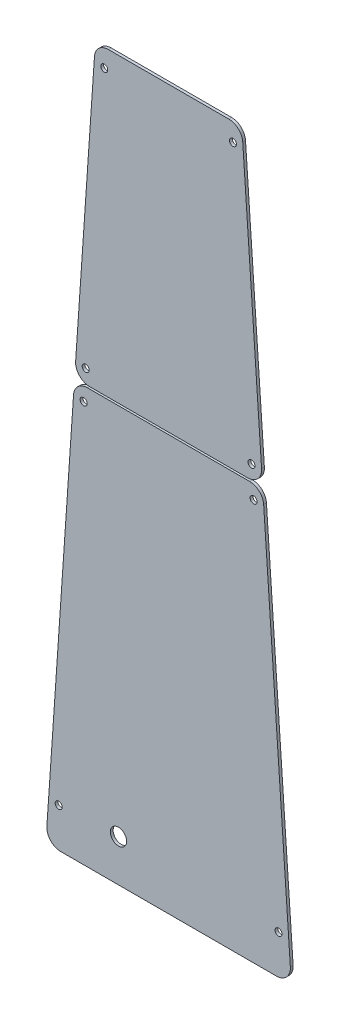
ISO-10303-21;
HEADER;
FILE_DESCRIPTION(('STEP AP214'),'2;1');
FILE_NAME('part.step','',(''),(''),'','','');
FILE_SCHEMA(('AUTOMOTIVE_DESIGN { 1 0 10303 214 1 1 1 1 }'));
ENDSEC;
DATA;
#1=APPLICATION_CONTEXT('core data for automotive mechanical design processes');
#2=APPLICATION_PROTOCOL_DEFINITION('international standard','automotive_design',2000,#1);
#3=PRODUCT_CONTEXT('',#1,'mechanical');
#4=PRODUCT('Part','Part','',(#3));
#5=PRODUCT_RELATED_PRODUCT_CATEGORY('part','',(#4));
#6=PRODUCT_DEFINITION_FORMATION('','',#4);
#7=PRODUCT_DEFINITION_CONTEXT('part definition',#1,'design');
#8=PRODUCT_DEFINITION('design','',#6,#7);
#9=PRODUCT_DEFINITION_SHAPE('','',#8);
#10=(LENGTH_UNIT() NAMED_UNIT(*) SI_UNIT(.MILLI.,.METRE.));
#11=(NAMED_UNIT(*) PLANE_ANGLE_UNIT() SI_UNIT($,.RADIAN.));
#12=(NAMED_UNIT(*) SI_UNIT($,.STERADIAN.) SOLID_ANGLE_UNIT());
#13=UNCERTAINTY_MEASURE_WITH_UNIT(LENGTH_MEASURE(1.E-05),#10,'distance_accuracy_value','');
#14=(GEOMETRIC_REPRESENTATION_CONTEXT(3) GLOBAL_UNCERTAINTY_ASSIGNED_CONTEXT((#13)) GLOBAL_UNIT_ASSIGNED_CONTEXT((#10,
#11,#12)) REPRESENTATION_CONTEXT('',''));
#15=CARTESIAN_POINT('',(0.,0.,0.));
#16=DIRECTION('',(0.,0.,1.));
#17=DIRECTION('',(1.,0.,0.));
#18=AXIS2_PLACEMENT_3D('',#15,#16,#17);
#19=CARTESIAN_POINT('',(87.5838343773248,6.03733227261171,2.));
#20=DIRECTION('',(0.997632620355245,0.0687688505293422,0.));
#21=DIRECTION('',(-0.0687688505293422,0.997632620355245,0.));
#22=AXIS2_PLACEMENT_3D('',#19,#20,#21);
#23=PLANE('',#22);
#24=DIRECTION('',(0.0687688505293422,-0.997632620355245,0.));
#25=VECTOR('',#24,1.);
#26=CARTESIAN_POINT('',(87.5838343773248,6.03733227261171,2.));
#27=LINE('',#26,#25);
#28=CARTESIAN_POINT('',(53.1419166175963,505.687688505293,2.));
#29=VERTEX_POINT('',#28);
#30=CARTESIAN_POINT('',(66.6525962292467,309.687688505294,2.));
#31=VERTEX_POINT('',#30);
#32=EDGE_CURVE('E127',#29,#31,#27,.T.);
#33=ORIENTED_EDGE('',*,*,#32,.T.);
#34=DIRECTION('',(0.,0.,-1.));
#35=VECTOR('',#34,1.);
#36=CARTESIAN_POINT('',(66.6525962292468,309.687688505293,2.));
#37=LINE('',#36,#35);
#38=CARTESIAN_POINT('',(66.6525962292467,309.687688505294,0.));
#39=VERTEX_POINT('',#38);
#40=EDGE_CURVE('E12',#31,#39,#37,.T.);
#41=ORIENTED_EDGE('',*,*,#40,.T.);
#42=DIRECTION('',(0.0687688505293422,-0.997632620355245,0.));
#43=VECTOR('',#42,1.);
#44=CARTESIAN_POINT('',(87.5838343773248,6.03733227261171,0.));
#45=LINE('',#44,#43);
#46=CARTESIAN_POINT('',(53.1419166175963,505.687688505293,0.));
#47=VERTEX_POINT('',#46);
#48=EDGE_CURVE('E142',#47,#39,#45,.T.);
#49=ORIENTED_EDGE('',*,*,#48,.F.);
#50=DIRECTION('',(0.,0.,-1.));
#51=VECTOR('',#50,1.);
#52=CARTESIAN_POINT('',(53.1419166175963,505.687688505293,2.));
#53=LINE('',#52,#51);
#54=EDGE_CURVE('E150',#47,#29,#53,.F.);
#55=ORIENTED_EDGE('',*,*,#54,.T.);
#56=EDGE_LOOP('',(#33,#41,#49,#55));
#57=FACE_BOUND('',#56,.T.);
#58=ADVANCED_FACE('F54',(#57),#23,.T.);
#59=CARTESIAN_POINT('',(-87.5838343773248,6.03733227261171,2.));
#60=DIRECTION('',(0.997632620355245,-0.0687688505293422,0.));
#61=DIRECTION('',(0.0687688505293422,0.997632620355245,0.));
#62=AXIS2_PLACEMENT_3D('',#59,#60,#61);
#63=PLANE('',#62);
#64=DIRECTION('',(-0.0687688505293422,-0.997632620355245,0.));
#65=VECTOR('',#64,1.);
#66=CARTESIAN_POINT('',(-87.5838343773248,6.03733227261171,0.));
#67=LINE('',#66,#65);
#68=CARTESIAN_POINT('',(-53.1419166175963,505.687688505293,0.));
#69=VERTEX_POINT('',#68);
#70=CARTESIAN_POINT('',(-66.6525962292467,309.687688505294,0.));
#71=VERTEX_POINT('',#70);
#72=EDGE_CURVE('E157',#69,#71,#67,.T.);
#73=ORIENTED_EDGE('',*,*,#72,.T.);
#74=DIRECTION('',(0.,0.,-1.));
#75=VECTOR('',#74,1.);
#76=CARTESIAN_POINT('',(-66.6525962292468,309.687688505293,2.));
#77=LINE('',#76,#75);
#78=CARTESIAN_POINT('',(-66.6525962292467,309.687688505294,2.));
#79=VERTEX_POINT('',#78);
#80=EDGE_CURVE('E77',#71,#79,#77,.F.);
#81=ORIENTED_EDGE('',*,*,#80,.T.);
#82=DIRECTION('',(-0.0687688505293422,-0.997632620355245,0.));
#83=VECTOR('',#82,1.);
#84=CARTESIAN_POINT('',(-87.5838343773248,6.03733227261171,2.));
#85=LINE('',#84,#83);
#86=CARTESIAN_POINT('',(-53.1419166175963,505.687688505293,2.));
#87=VERTEX_POINT('',#86);
#88=EDGE_CURVE('E176',#87,#79,#85,.T.);
#89=ORIENTED_EDGE('',*,*,#88,.F.);
#90=DIRECTION('',(0.,0.,-1.));
#91=VECTOR('',#90,1.);
#92=CARTESIAN_POINT('',(-53.1419166175963,505.687688505293,0.));
#93=LINE('',#92,#91);
#94=EDGE_CURVE('E151',#87,#69,#93,.T.);
#95=ORIENTED_EDGE('',*,*,#94,.T.);
#96=EDGE_LOOP('',(#73,#81,#89,#95));
#97=FACE_BOUND('',#96,.T.);
#98=ADVANCED_FACE('F217',(#97),#63,.F.);
#99=CARTESIAN_POINT('',(0.,0.,2.));
#100=DIRECTION('',(0.,0.,1.));
#101=DIRECTION('',(1.,0.,0.));
#102=AXIS2_PLACEMENT_3D('',#99,#100,#101);
#103=PLANE('',#102);
#104=CARTESIAN_POINT('',(-59.4327957686284,309.,2.));
#105=DIRECTION('',(0.,0.,1.));
#106=DIRECTION('',(1.,0.,0.));
#107=AXIS2_PLACEMENT_3D('',#104,#105,#106);
#108=CIRCLE('',#107,2.5);
#109=CARTESIAN_POINT('',(-56.9327957686284,309.,2.));
#110=VERTEX_POINT('',#109);
#111=EDGE_CURVE('E177',#110,#110,#108,.F.);
#112=ORIENTED_EDGE('',*,*,#111,.T.);
#113=EDGE_LOOP('',(#112));
#114=FACE_BOUND('',#113,.T.);
#115=CARTESIAN_POINT('',(46.1289122734827,502.,2.));
#116=DIRECTION('',(0.,0.,1.));
#117=DIRECTION('',(1.,0.,0.));
#118=AXIS2_PLACEMENT_3D('',#115,#116,#117);
#119=CIRCLE('',#118,2.5);
#120=CARTESIAN_POINT('',(48.6289122734827,502.,2.));
#121=VERTEX_POINT('',#120);
#122=EDGE_CURVE('E169',#121,#121,#119,.T.);
#123=ORIENTED_EDGE('',*,*,#122,.F.);
#124=EDGE_LOOP('',(#123));
#125=FACE_BOUND('',#124,.T.);
#126=CARTESIAN_POINT('',(-46.1289122734827,502.,2.));
#127=DIRECTION('',(0.,0.,1.));
#128=DIRECTION('',(1.,0.,0.));
#129=AXIS2_PLACEMENT_3D('',#126,#127,#128);
#130=CIRCLE('',#129,2.5);
#131=CARTESIAN_POINT('',(-43.6289122734827,502.,2.));
#132=VERTEX_POINT('',#131);
#133=EDGE_CURVE('E173',#132,#132,#130,.F.);
#134=ORIENTED_EDGE('',*,*,#133,.T.);
#135=EDGE_LOOP('',(#134));
#136=FACE_BOUND('',#135,.T.);
#137=CARTESIAN_POINT('',(59.4327957686284,309.,2.));
#138=DIRECTION('',(0.,0.,1.));
#139=DIRECTION('',(1.,0.,0.));
#140=AXIS2_PLACEMENT_3D('',#137,#138,#139);
#141=CIRCLE('',#140,2.5);
#142=CARTESIAN_POINT('',(61.9327957686284,309.,2.));
#143=VERTEX_POINT('',#142);
#144=EDGE_CURVE('E171',#143,#143,#141,.T.);
#145=ORIENTED_EDGE('',*,*,#144,.F.);
#146=EDGE_LOOP('',(#145));
#147=FACE_BOUND('',#146,.T.);
#148=ORIENTED_EDGE('',*,*,#88,.T.);
#149=CARTESIAN_POINT('',(-56.6762700256943,309.,2.));
#150=DIRECTION('',(0.,0.,1.));
#151=DIRECTION('',(1.,0.,0.));
#152=AXIS2_PLACEMENT_3D('',#149,#150,#151);
#153=CIRCLE('',#152,10.);
#154=CARTESIAN_POINT('',(-56.6762700256943,299.,2.));
#155=VERTEX_POINT('',#154);
#156=EDGE_CURVE('E62',#79,#155,#153,.T.);
#157=ORIENTED_EDGE('',*,*,#156,.T.);
#158=DIRECTION('',(1.,0.,0.));
#159=VECTOR('',#158,1.);
#160=CARTESIAN_POINT('',(0.,299.,2.));
#161=LINE('',#160,#159);
#162=CARTESIAN_POINT('',(56.6762700256943,299.,2.));
#163=VERTEX_POINT('',#162);
#164=EDGE_CURVE('E132',#155,#163,#161,.T.);
#165=ORIENTED_EDGE('',*,*,#164,.T.);
#166=CARTESIAN_POINT('',(56.6762700256943,309.,2.));
#167=DIRECTION('',(0.,0.,1.));
#168=DIRECTION('',(1.,0.,0.));
#169=AXIS2_PLACEMENT_3D('',#166,#167,#168);
#170=CIRCLE('',#169,10.);
#171=EDGE_CURVE('E69',#163,#31,#170,.T.);
#172=ORIENTED_EDGE('',*,*,#171,.T.);
#173=ORIENTED_EDGE('',*,*,#32,.F.);
#174=CARTESIAN_POINT('',(43.1655904140438,505.,2.));
#175=DIRECTION('',(0.,0.,1.));
#176=DIRECTION('',(1.,0.,0.));
#177=AXIS2_PLACEMENT_3D('',#174,#175,#176);
#178=CIRCLE('',#177,10.);
#179=CARTESIAN_POINT('',(43.1655904140438,515.,2.));
#180=VERTEX_POINT('',#179);
#181=EDGE_CURVE('E122',#29,#180,#178,.T.);
#182=ORIENTED_EDGE('',*,*,#181,.T.);
#183=DIRECTION('',(1.,0.,0.));
#184=VECTOR('',#183,1.);
#185=CARTESIAN_POINT('',(0.,515.,2.));
#186=LINE('',#185,#184);
#187=CARTESIAN_POINT('',(-43.1655904140438,515.,2.));
#188=VERTEX_POINT('',#187);
#189=EDGE_CURVE('E125',#188,#180,#186,.T.);
#190=ORIENTED_EDGE('',*,*,#189,.F.);
#191=CARTESIAN_POINT('',(-43.1655904140438,505.,2.));
#192=DIRECTION('',(0.,0.,1.));
#193=DIRECTION('',(1.,0.,0.));
#194=AXIS2_PLACEMENT_3D('',#191,#192,#193);
#195=CIRCLE('',#194,10.);
#196=EDGE_CURVE('E131',#188,#87,#195,.T.);
#197=ORIENTED_EDGE('',*,*,#196,.T.);
#198=EDGE_LOOP('',(#148,#157,#165,#172,#173,#182,#190,#197));
#199=FACE_BOUND('',#198,.T.);
#200=ADVANCED_FACE('F124',(#114,#125,#136,#147,#199),#103,.T.);
#201=CARTESIAN_POINT('',(0.,0.,0.));
#202=DIRECTION('',(0.,0.,1.));
#203=DIRECTION('',(1.,0.,0.));
#204=AXIS2_PLACEMENT_3D('',#201,#202,#203);
#205=PLANE('',#204);
#206=CARTESIAN_POINT('',(59.4327957686284,309.,0.));
#207=DIRECTION('',(0.,0.,-1.));
#208=DIRECTION('',(-1.,0.,0.));
#209=AXIS2_PLACEMENT_3D('',#206,#207,#208);
#210=CIRCLE('',#209,2.5);
#211=CARTESIAN_POINT('',(56.9327957686284,309.,0.));
#212=VERTEX_POINT('',#211);
#213=EDGE_CURVE('E181',#212,#212,#210,.T.);
#214=ORIENTED_EDGE('',*,*,#213,.F.);
#215=EDGE_LOOP('',(#214));
#216=FACE_BOUND('',#215,.T.);
#217=CARTESIAN_POINT('',(-46.1289122734827,502.,0.));
#218=DIRECTION('',(0.,0.,1.));
#219=DIRECTION('',(1.,0.,0.));
#220=AXIS2_PLACEMENT_3D('',#217,#218,#219);
#221=CIRCLE('',#220,2.5);
#222=CARTESIAN_POINT('',(-43.6289122734827,502.,0.));
#223=VERTEX_POINT('',#222);
#224=EDGE_CURVE('E147',#223,#223,#221,.F.);
#225=ORIENTED_EDGE('',*,*,#224,.F.);
#226=EDGE_LOOP('',(#225));
#227=FACE_BOUND('',#226,.T.);
#228=CARTESIAN_POINT('',(46.1289122734827,502.,0.));
#229=DIRECTION('',(0.,0.,1.));
#230=DIRECTION('',(1.,0.,0.));
#231=AXIS2_PLACEMENT_3D('',#228,#229,#230);
#232=CIRCLE('',#231,2.5);
#233=CARTESIAN_POINT('',(48.6289122734827,502.,0.));
#234=VERTEX_POINT('',#233);
#235=EDGE_CURVE('E154',#234,#234,#232,.T.);
#236=ORIENTED_EDGE('',*,*,#235,.T.);
#237=EDGE_LOOP('',(#236));
#238=FACE_BOUND('',#237,.T.);
#239=CARTESIAN_POINT('',(-59.4327957686284,309.,0.));
#240=DIRECTION('',(0.,0.,-1.));
#241=DIRECTION('',(-1.,0.,0.));
#242=AXIS2_PLACEMENT_3D('',#239,#240,#241);
#243=CIRCLE('',#242,2.5);
#244=CARTESIAN_POINT('',(-61.9327957686284,309.,0.));
#245=VERTEX_POINT('',#244);
#246=EDGE_CURVE('E165',#245,#245,#243,.F.);
#247=ORIENTED_EDGE('',*,*,#246,.T.);
#248=EDGE_LOOP('',(#247));
#249=FACE_BOUND('',#248,.T.);
#250=DIRECTION('',(-1.,0.,0.));
#251=VECTOR('',#250,1.);
#252=CARTESIAN_POINT('',(0.,299.,0.));
#253=LINE('',#252,#251);
#254=CARTESIAN_POINT('',(56.6762700256943,299.,0.));
#255=VERTEX_POINT('',#254);
#256=CARTESIAN_POINT('',(-56.6762700256943,299.,0.));
#257=VERTEX_POINT('',#256);
#258=EDGE_CURVE('E162',#255,#257,#253,.T.);
#259=ORIENTED_EDGE('',*,*,#258,.T.);
#260=CARTESIAN_POINT('',(-56.6762700256943,309.,0.));
#261=DIRECTION('',(0.,0.,1.));
#262=DIRECTION('',(1.,0.,0.));
#263=AXIS2_PLACEMENT_3D('',#260,#261,#262);
#264=CIRCLE('',#263,10.);
#265=EDGE_CURVE('E202',#257,#71,#264,.F.);
#266=ORIENTED_EDGE('',*,*,#265,.T.);
#267=ORIENTED_EDGE('',*,*,#72,.F.);
#268=CARTESIAN_POINT('',(-43.1655904140438,505.,0.));
#269=DIRECTION('',(0.,0.,1.));
#270=DIRECTION('',(1.,0.,0.));
#271=AXIS2_PLACEMENT_3D('',#268,#269,#270);
#272=CIRCLE('',#271,10.);
#273=CARTESIAN_POINT('',(-43.1655904140438,515.,0.));
#274=VERTEX_POINT('',#273);
#275=EDGE_CURVE('E160',#69,#274,#272,.F.);
#276=ORIENTED_EDGE('',*,*,#275,.T.);
#277=DIRECTION('',(1.,0.,0.));
#278=VECTOR('',#277,1.);
#279=CARTESIAN_POINT('',(0.,515.,0.));
#280=LINE('',#279,#278);
#281=CARTESIAN_POINT('',(43.1655904140438,515.,0.));
#282=VERTEX_POINT('',#281);
#283=EDGE_CURVE('E159',#274,#282,#280,.T.);
#284=ORIENTED_EDGE('',*,*,#283,.T.);
#285=CARTESIAN_POINT('',(43.1655904140438,505.,0.));
#286=DIRECTION('',(0.,0.,1.));
#287=DIRECTION('',(1.,0.,0.));
#288=AXIS2_PLACEMENT_3D('',#285,#286,#287);
#289=CIRCLE('',#288,10.);
#290=EDGE_CURVE('E145',#282,#47,#289,.F.);
#291=ORIENTED_EDGE('',*,*,#290,.T.);
#292=ORIENTED_EDGE('',*,*,#48,.T.);
#293=CARTESIAN_POINT('',(56.6762700256943,309.,0.));
#294=DIRECTION('',(0.,0.,1.));
#295=DIRECTION('',(1.,0.,0.));
#296=AXIS2_PLACEMENT_3D('',#293,#294,#295);
#297=CIRCLE('',#296,10.);
#298=EDGE_CURVE('E200',#39,#255,#297,.F.);
#299=ORIENTED_EDGE('',*,*,#298,.T.);
#300=EDGE_LOOP('',(#259,#266,#267,#276,#284,#291,#292,#299));
#301=FACE_BOUND('',#300,.T.);
#302=ADVANCED_FACE('F216',(#216,#227,#238,#249,#301),#205,.F.);
#303=CARTESIAN_POINT('',(0.,515.,2.));
#304=DIRECTION('',(0.,1.,0.));
#305=DIRECTION('',(0.,0.,1.));
#306=AXIS2_PLACEMENT_3D('',#303,#304,#305);
#307=PLANE('',#306);
#308=ORIENTED_EDGE('',*,*,#189,.T.);
#309=DIRECTION('',(0.,0.,-1.));
#310=VECTOR('',#309,1.);
#311=CARTESIAN_POINT('',(43.1655904140438,515.,2.));
#312=LINE('',#311,#310);
#313=EDGE_CURVE('E138',#180,#282,#312,.T.);
#314=ORIENTED_EDGE('',*,*,#313,.T.);
#315=ORIENTED_EDGE('',*,*,#283,.F.);
#316=DIRECTION('',(0.,0.,-1.));
#317=VECTOR('',#316,1.);
#318=CARTESIAN_POINT('',(-43.1655904140438,515.,2.));
#319=LINE('',#318,#317);
#320=EDGE_CURVE('E141',#274,#188,#319,.F.);
#321=ORIENTED_EDGE('',*,*,#320,.T.);
#322=EDGE_LOOP('',(#308,#314,#315,#321));
#323=FACE_BOUND('',#322,.T.);
#324=ADVANCED_FACE('F136',(#323),#307,.T.);
#325=CARTESIAN_POINT('',(-46.1289122734827,502.,2.));
#326=DIRECTION('',(0.,0.,-1.));
#327=DIRECTION('',(-1.,0.,0.));
#328=AXIS2_PLACEMENT_3D('',#325,#326,#327);
#329=CYLINDRICAL_SURFACE('',#328,2.5);
#330=ORIENTED_EDGE('',*,*,#133,.F.);
#331=EDGE_LOOP('',(#330));
#332=FACE_BOUND('',#331,.T.);
#333=ORIENTED_EDGE('',*,*,#224,.T.);
#334=EDGE_LOOP('',(#333));
#335=FACE_BOUND('',#334,.T.);
#336=ADVANCED_FACE('F255',(#332,#335),#329,.F.);
#337=CARTESIAN_POINT('',(46.1289122734827,502.,2.));
#338=DIRECTION('',(0.,0.,-1.));
#339=DIRECTION('',(-1.,0.,0.));
#340=AXIS2_PLACEMENT_3D('',#337,#338,#339);
#341=CYLINDRICAL_SURFACE('',#340,2.5);
#342=ORIENTED_EDGE('',*,*,#122,.T.);
#343=EDGE_LOOP('',(#342));
#344=FACE_BOUND('',#343,.T.);
#345=ORIENTED_EDGE('',*,*,#235,.F.);
#346=EDGE_LOOP('',(#345));
#347=FACE_BOUND('',#346,.T.);
#348=ADVANCED_FACE('F252',(#344,#347),#341,.F.);
#349=CARTESIAN_POINT('',(43.1655904140438,505.,2.));
#350=DIRECTION('',(0.,0.,-1.));
#351=DIRECTION('',(-1.,0.,0.));
#352=AXIS2_PLACEMENT_3D('',#349,#350,#351);
#353=CYLINDRICAL_SURFACE('',#352,10.);
#354=ORIENTED_EDGE('',*,*,#181,.F.);
#355=ORIENTED_EDGE('',*,*,#54,.F.);
#356=ORIENTED_EDGE('',*,*,#290,.F.);
#357=ORIENTED_EDGE('',*,*,#313,.F.);
#358=EDGE_LOOP('',(#354,#355,#356,#357));
#359=FACE_BOUND('',#358,.T.);
#360=ADVANCED_FACE('F144',(#359),#353,.T.);
#361=CARTESIAN_POINT('',(-43.1655904140438,505.,2.));
#362=DIRECTION('',(0.,0.,1.));
#363=DIRECTION('',(1.,0.,0.));
#364=AXIS2_PLACEMENT_3D('',#361,#362,#363);
#365=CYLINDRICAL_SURFACE('',#364,10.);
#366=ORIENTED_EDGE('',*,*,#196,.F.);
#367=ORIENTED_EDGE('',*,*,#320,.F.);
#368=ORIENTED_EDGE('',*,*,#275,.F.);
#369=ORIENTED_EDGE('',*,*,#94,.F.);
#370=EDGE_LOOP('',(#366,#367,#368,#369));
#371=FACE_BOUND('',#370,.T.);
#372=ADVANCED_FACE('F220',(#371),#365,.T.);
#373=CARTESIAN_POINT('',(-59.4327957686284,309.,10.));
#374=DIRECTION('',(0.,0.,-1.));
#375=DIRECTION('',(-1.,0.,0.));
#376=AXIS2_PLACEMENT_3D('',#373,#374,#375);
#377=CYLINDRICAL_SURFACE('',#376,2.5);
#378=ORIENTED_EDGE('',*,*,#111,.F.);
#379=EDGE_LOOP('',(#378));
#380=FACE_BOUND('',#379,.T.);
#381=ORIENTED_EDGE('',*,*,#246,.F.);
#382=EDGE_LOOP('',(#381));
#383=FACE_BOUND('',#382,.T.);
#384=ADVANCED_FACE('F243',(#380,#383),#377,.F.);
#385=CARTESIAN_POINT('',(59.4327957686284,309.,10.));
#386=DIRECTION('',(0.,0.,-1.));
#387=DIRECTION('',(-1.,0.,0.));
#388=AXIS2_PLACEMENT_3D('',#385,#386,#387);
#389=CYLINDRICAL_SURFACE('',#388,2.5);
#390=ORIENTED_EDGE('',*,*,#144,.T.);
#391=EDGE_LOOP('',(#390));
#392=FACE_BOUND('',#391,.T.);
#393=ORIENTED_EDGE('',*,*,#213,.T.);
#394=EDGE_LOOP('',(#393));
#395=FACE_BOUND('',#394,.T.);
#396=ADVANCED_FACE('F246',(#392,#395),#389,.F.);
#397=CARTESIAN_POINT('',(0.,299.,10.));
#398=DIRECTION('',(0.,-1.,0.));
#399=DIRECTION('',(0.,0.,-1.));
#400=AXIS2_PLACEMENT_3D('',#397,#398,#399);
#401=PLANE('',#400);
#402=ORIENTED_EDGE('',*,*,#164,.F.);
#403=DIRECTION('',(0.,0.,-1.));
#404=VECTOR('',#403,1.);
#405=CARTESIAN_POINT('',(-56.6762700256943,299.,0.));
#406=LINE('',#405,#404);
#407=EDGE_CURVE('E197',#155,#257,#406,.T.);
#408=ORIENTED_EDGE('',*,*,#407,.T.);
#409=ORIENTED_EDGE('',*,*,#258,.F.);
#410=DIRECTION('',(0.,0.,-1.));
#411=VECTOR('',#410,1.);
#412=CARTESIAN_POINT('',(56.6762700256943,299.,10.));
#413=LINE('',#412,#411);
#414=EDGE_CURVE('E186',#255,#163,#413,.F.);
#415=ORIENTED_EDGE('',*,*,#414,.T.);
#416=EDGE_LOOP('',(#402,#408,#409,#415));
#417=FACE_BOUND('',#416,.T.);
#418=ADVANCED_FACE('F210',(#417),#401,.T.);
#419=CARTESIAN_POINT('',(-56.6762700256943,309.,10.));
#420=DIRECTION('',(0.,0.,1.));
#421=DIRECTION('',(1.,0.,0.));
#422=AXIS2_PLACEMENT_3D('',#419,#420,#421);
#423=CYLINDRICAL_SURFACE('',#422,10.);
#424=ORIENTED_EDGE('',*,*,#156,.F.);
#425=ORIENTED_EDGE('',*,*,#80,.F.);
#426=ORIENTED_EDGE('',*,*,#265,.F.);
#427=ORIENTED_EDGE('',*,*,#407,.F.);
#428=EDGE_LOOP('',(#424,#425,#426,#427));
#429=FACE_BOUND('',#428,.T.);
#430=ADVANCED_FACE('F213',(#429),#423,.T.);
#431=CARTESIAN_POINT('',(56.6762700256943,309.,2.));
#432=DIRECTION('',(0.,0.,-1.));
#433=DIRECTION('',(-1.,0.,0.));
#434=AXIS2_PLACEMENT_3D('',#431,#432,#433);
#435=CYLINDRICAL_SURFACE('',#434,10.);
#436=ORIENTED_EDGE('',*,*,#171,.F.);
#437=ORIENTED_EDGE('',*,*,#414,.F.);
#438=ORIENTED_EDGE('',*,*,#298,.F.);
#439=ORIENTED_EDGE('',*,*,#40,.F.);
#440=EDGE_LOOP('',(#436,#437,#438,#439));
#441=FACE_BOUND('',#440,.T.);
#442=ADVANCED_FACE('F56',(#441),#435,.T.);
#443=CLOSED_SHELL('',(#58,#98,#200,#302,#324,#336,#348,#360,#372,#384,#396,#418,#430,#442));
#444=MANIFOLD_SOLID_BREP('B2',#443);
#445=CARTESIAN_POINT('',(78.799252079308,28.05,2.));
#446=DIRECTION('',(0.,0.,-1.));
#447=DIRECTION('',(-1.,0.,0.));
#448=AXIS2_PLACEMENT_3D('',#445,#446,#447);
#449=CYLINDRICAL_SURFACE('',#448,2.50000000000001);
#450=CARTESIAN_POINT('',(78.799252079308,28.05,2.));
#451=DIRECTION('',(0.,0.,1.));
#452=DIRECTION('',(1.,0.,0.));
#453=AXIS2_PLACEMENT_3D('',#450,#451,#452);
#454=CIRCLE('',#453,2.50000000000001);
#455=CARTESIAN_POINT('',(81.299252079308,28.05,2.));
#456=VERTEX_POINT('',#455);
#457=EDGE_CURVE('E464',#456,#456,#454,.T.);
#458=ORIENTED_EDGE('',*,*,#457,.T.);
#459=EDGE_LOOP('',(#458));
#460=FACE_BOUND('',#459,.T.);
#461=CARTESIAN_POINT('',(78.799252079308,28.05,0.));
#462=DIRECTION('',(0.,0.,1.));
#463=DIRECTION('',(1.,0.,0.));
#464=AXIS2_PLACEMENT_3D('',#461,#462,#463);
#465=CIRCLE('',#464,2.50000000000001);
#466=CARTESIAN_POINT('',(81.299252079308,28.05,0.));
#467=VERTEX_POINT('',#466);
#468=EDGE_CURVE('E471',#467,#467,#465,.T.);
#469=ORIENTED_EDGE('',*,*,#468,.F.);
#470=EDGE_LOOP('',(#469));
#471=FACE_BOUND('',#470,.T.);
#472=ADVANCED_FACE('F371',(#460,#471),#449,.F.);
#473=CARTESIAN_POINT('',(-77.2869496373448,9.99999999999998,2.));
#474=DIRECTION('',(0.,0.,1.));
#475=DIRECTION('',(1.,0.,0.));
#476=AXIS2_PLACEMENT_3D('',#473,#474,#475);
#477=CYLINDRICAL_SURFACE('',#476,10.);
#478=CARTESIAN_POINT('',(-77.2869496373448,9.99999999999998,2.));
#479=DIRECTION('',(0.,0.,1.));
#480=DIRECTION('',(1.,0.,0.));
#481=AXIS2_PLACEMENT_3D('',#478,#479,#480);
#482=CIRCLE('',#481,10.);
#483=CARTESIAN_POINT('',(-87.2632758408973,10.6876885052934,2.));
#484=VERTEX_POINT('',#483);
#485=CARTESIAN_POINT('',(-77.2869496373448,0.,2.));
#486=VERTEX_POINT('',#485);
#487=EDGE_CURVE('E479',#484,#486,#482,.T.);
#488=ORIENTED_EDGE('',*,*,#487,.F.);
#489=DIRECTION('',(0.,0.,-1.));
#490=VECTOR('',#489,1.);
#491=CARTESIAN_POINT('',(-87.2632758408973,10.6876885052934,2.));
#492=LINE('',#491,#490);
#493=CARTESIAN_POINT('',(-87.2632758408973,10.6876885052934,0.));
#494=VERTEX_POINT('',#493);
#495=EDGE_CURVE('E475',#494,#484,#492,.F.);
#496=ORIENTED_EDGE('',*,*,#495,.F.);
#497=CARTESIAN_POINT('',(-77.2869496373448,9.99999999999998,0.));
#498=DIRECTION('',(0.,0.,1.));
#499=DIRECTION('',(1.,0.,0.));
#500=AXIS2_PLACEMENT_3D('',#497,#498,#499);
#501=CIRCLE('',#500,10.);
#502=CARTESIAN_POINT('',(-77.2869496373448,0.,0.));
#503=VERTEX_POINT('',#502);
#504=EDGE_CURVE('E448',#503,#494,#501,.F.);
#505=ORIENTED_EDGE('',*,*,#504,.F.);
#506=DIRECTION('',(0.,0.,-1.));
#507=VECTOR('',#506,1.);
#508=CARTESIAN_POINT('',(-77.2869496373448,0.,0.));
#509=LINE('',#508,#507);
#510=EDGE_CURVE('E449',#486,#503,#509,.T.);
#511=ORIENTED_EDGE('',*,*,#510,.F.);
#512=EDGE_LOOP('',(#488,#496,#505,#511));
#513=FACE_BOUND('',#512,.T.);
#514=ADVANCED_FACE('F547',(#513),#477,.T.);
#515=CARTESIAN_POINT('',(0.,0.,2.));
#516=DIRECTION('',(0.,-1.,0.));
#517=DIRECTION('',(0.,0.,-1.));
#518=AXIS2_PLACEMENT_3D('',#515,#516,#517);
#519=PLANE('',#518);
#520=DIRECTION('',(-1.,0.,0.));
#521=VECTOR('',#520,1.);
#522=CARTESIAN_POINT('',(0.,0.,2.));
#523=LINE('',#522,#521);
#524=CARTESIAN_POINT('',(77.2869496373448,0.,2.));
#525=VERTEX_POINT('',#524);
#526=EDGE_CURVE('E537',#525,#486,#523,.T.);
#527=ORIENTED_EDGE('',*,*,#526,.T.);
#528=ORIENTED_EDGE('',*,*,#510,.T.);
#529=DIRECTION('',(-1.,0.,0.));
#530=VECTOR('',#529,1.);
#531=CARTESIAN_POINT('',(0.,0.,0.));
#532=LINE('',#531,#530);
#533=CARTESIAN_POINT('',(77.2869496373448,0.,0.));
#534=VERTEX_POINT('',#533);
#535=EDGE_CURVE('E442',#534,#503,#532,.T.);
#536=ORIENTED_EDGE('',*,*,#535,.F.);
#537=DIRECTION('',(0.,0.,-1.));
#538=VECTOR('',#537,1.);
#539=CARTESIAN_POINT('',(77.2869496373448,0.,2.));
#540=LINE('',#539,#538);
#541=EDGE_CURVE('E455',#534,#525,#540,.F.);
#542=ORIENTED_EDGE('',*,*,#541,.T.);
#543=EDGE_LOOP('',(#527,#528,#536,#542));
#544=FACE_BOUND('',#543,.T.);
#545=ADVANCED_FACE('F454',(#544),#519,.T.);
#546=CARTESIAN_POINT('',(77.2869496373448,9.99999999999998,2.));
#547=DIRECTION('',(0.,0.,-1.));
#548=DIRECTION('',(-1.,0.,0.));
#549=AXIS2_PLACEMENT_3D('',#546,#547,#548);
#550=CYLINDRICAL_SURFACE('',#549,10.);
#551=CARTESIAN_POINT('',(77.2869496373448,9.99999999999998,2.));
#552=DIRECTION('',(0.,0.,1.));
#553=DIRECTION('',(1.,0.,0.));
#554=AXIS2_PLACEMENT_3D('',#551,#552,#553);
#555=CIRCLE('',#554,10.);
#556=CARTESIAN_POINT('',(87.2632758408973,10.6876885052934,2.));
#557=VERTEX_POINT('',#556);
#558=EDGE_CURVE('E463',#525,#557,#555,.T.);
#559=ORIENTED_EDGE('',*,*,#558,.F.);
#560=ORIENTED_EDGE('',*,*,#541,.F.);
#561=CARTESIAN_POINT('',(77.2869496373448,9.99999999999998,0.));
#562=DIRECTION('',(0.,0.,1.));
#563=DIRECTION('',(1.,0.,0.));
#564=AXIS2_PLACEMENT_3D('',#561,#562,#563);
#565=CIRCLE('',#564,10.);
#566=CARTESIAN_POINT('',(87.2632758408973,10.6876885052934,0.));
#567=VERTEX_POINT('',#566);
#568=EDGE_CURVE('E436',#567,#534,#565,.F.);
#569=ORIENTED_EDGE('',*,*,#568,.F.);
#570=DIRECTION('',(0.,0.,-1.));
#571=VECTOR('',#570,1.);
#572=CARTESIAN_POINT('',(87.2632758408973,10.6876885052934,2.));
#573=LINE('',#572,#571);
#574=EDGE_CURVE('E481',#557,#567,#573,.T.);
#575=ORIENTED_EDGE('',*,*,#574,.F.);
#576=EDGE_LOOP('',(#559,#560,#569,#575));
#577=FACE_BOUND('',#576,.T.);
#578=ADVANCED_FACE('F461',(#577),#550,.T.);
#579=CARTESIAN_POINT('',(-78.799252079308,28.05,2.));
#580=DIRECTION('',(0.,0.,-1.));
#581=DIRECTION('',(-1.,0.,0.));
#582=AXIS2_PLACEMENT_3D('',#579,#580,#581);
#583=CYLINDRICAL_SURFACE('',#582,2.50000000000001);
#584=CARTESIAN_POINT('',(-78.799252079308,28.05,2.));
#585=DIRECTION('',(0.,0.,1.));
#586=DIRECTION('',(1.,0.,0.));
#587=AXIS2_PLACEMENT_3D('',#584,#585,#586);
#588=CIRCLE('',#587,2.50000000000001);
#589=CARTESIAN_POINT('',(-76.299252079308,28.05,2.));
#590=VERTEX_POINT('',#589);
#591=EDGE_CURVE('E534',#590,#590,#588,.F.);
#592=ORIENTED_EDGE('',*,*,#591,.F.);
#593=EDGE_LOOP('',(#592));
#594=FACE_BOUND('',#593,.T.);
#595=CARTESIAN_POINT('',(-78.799252079308,28.05,0.));
#596=DIRECTION('',(0.,0.,1.));
#597=DIRECTION('',(1.,0.,0.));
#598=AXIS2_PLACEMENT_3D('',#595,#596,#597);
#599=CIRCLE('',#598,2.50000000000001);
#600=CARTESIAN_POINT('',(-76.299252079308,28.05,0.));
#601=VERTEX_POINT('',#600);
#602=EDGE_CURVE('E458',#601,#601,#599,.F.);
#603=ORIENTED_EDGE('',*,*,#602,.T.);
#604=EDGE_LOOP('',(#603));
#605=FACE_BOUND('',#604,.T.);
#606=ADVANCED_FACE('F567',(#594,#605),#583,.F.);
#607=CARTESIAN_POINT('',(0.,0.,0.));
#608=DIRECTION('',(0.,0.,1.));
#609=DIRECTION('',(1.,0.,0.));
#610=AXIS2_PLACEMENT_3D('',#607,#608,#609);
#611=PLANE('',#610);
#612=CARTESIAN_POINT('',(-35.9320388349515,30.,0.));
#613=DIRECTION('',(0.,0.,1.));
#614=DIRECTION('',(1.,0.,0.));
#615=AXIS2_PLACEMENT_3D('',#612,#613,#614);
#616=CIRCLE('',#615,5.825);
#617=CARTESIAN_POINT('',(-30.1070388349514,30.,0.));
#618=VERTEX_POINT('',#617);
#619=EDGE_CURVE('E524',#618,#618,#616,.T.);
#620=ORIENTED_EDGE('',*,*,#619,.T.);
#621=EDGE_LOOP('',(#620));
#622=FACE_BOUND('',#621,.T.);
#623=CARTESIAN_POINT('',(60.9148346035798,287.5,0.));
#624=DIRECTION('',(0.,0.,-1.));
#625=DIRECTION('',(-1.,0.,0.));
#626=AXIS2_PLACEMENT_3D('',#623,#624,#625);
#627=CIRCLE('',#626,2.5);
#628=CARTESIAN_POINT('',(58.4148346035798,287.5,0.));
#629=VERTEX_POINT('',#628);
#630=EDGE_CURVE('E517',#629,#629,#627,.T.);
#631=ORIENTED_EDGE('',*,*,#630,.F.);
#632=EDGE_LOOP('',(#631));
#633=FACE_BOUND('',#632,.T.);
#634=ORIENTED_EDGE('',*,*,#602,.F.);
#635=EDGE_LOOP('',(#634));
#636=FACE_BOUND('',#635,.T.);
#637=DIRECTION('',(-0.0687688505293422,-0.997632620355245,0.));
#638=VECTOR('',#637,1.);
#639=CARTESIAN_POINT('',(-87.5838343773248,6.03733227261171,0.));
#640=LINE('',#639,#638);
#641=CARTESIAN_POINT('',(-68.1346350641982,288.187688505294,0.));
#642=VERTEX_POINT('',#641);
#643=EDGE_CURVE('E513',#642,#494,#640,.T.);
#644=ORIENTED_EDGE('',*,*,#643,.F.);
#645=CARTESIAN_POINT('',(-58.1583088606458,287.5,0.));
#646=DIRECTION('',(0.,0.,1.));
#647=DIRECTION('',(1.,0.,0.));
#648=AXIS2_PLACEMENT_3D('',#645,#646,#647);
#649=CIRCLE('',#648,10.);
#650=CARTESIAN_POINT('',(-58.1583088606458,297.5,0.));
#651=VERTEX_POINT('',#650);
#652=EDGE_CURVE('E488',#642,#651,#649,.F.);
#653=ORIENTED_EDGE('',*,*,#652,.T.);
#654=DIRECTION('',(-1.,0.,0.));
#655=VECTOR('',#654,1.);
#656=CARTESIAN_POINT('',(0.,297.5,0.));
#657=LINE('',#656,#655);
#658=CARTESIAN_POINT('',(58.1583088606458,297.5,0.));
#659=VERTEX_POINT('',#658);
#660=EDGE_CURVE('E512',#659,#651,#657,.T.);
#661=ORIENTED_EDGE('',*,*,#660,.F.);
#662=CARTESIAN_POINT('',(58.1583088606458,287.5,0.));
#663=DIRECTION('',(0.,0.,1.));
#664=DIRECTION('',(1.,0.,0.));
#665=AXIS2_PLACEMENT_3D('',#662,#663,#664);
#666=CIRCLE('',#665,10.);
#667=CARTESIAN_POINT('',(68.1346350641982,288.187688505294,0.));
#668=VERTEX_POINT('',#667);
#669=EDGE_CURVE('E486',#659,#668,#666,.F.);
#670=ORIENTED_EDGE('',*,*,#669,.T.);
#671=DIRECTION('',(0.0687688505293422,-0.997632620355245,0.));
#672=VECTOR('',#671,1.);
#673=CARTESIAN_POINT('',(87.5838343773248,6.03733227261171,0.));
#674=LINE('',#673,#672);
#675=EDGE_CURVE('E443',#668,#567,#674,.T.);
#676=ORIENTED_EDGE('',*,*,#675,.T.);
#677=ORIENTED_EDGE('',*,*,#568,.T.);
#678=ORIENTED_EDGE('',*,*,#535,.T.);
#679=ORIENTED_EDGE('',*,*,#504,.T.);
#680=EDGE_LOOP('',(#644,#653,#661,#670,#676,#677,#678,#679));
#681=FACE_BOUND('',#680,.T.);
#682=ORIENTED_EDGE('',*,*,#468,.T.);
#683=EDGE_LOOP('',(#682));
#684=FACE_BOUND('',#683,.T.);
#685=CARTESIAN_POINT('',(-60.9148346035798,287.5,0.));
#686=DIRECTION('',(0.,0.,-1.));
#687=DIRECTION('',(-1.,0.,0.));
#688=AXIS2_PLACEMENT_3D('',#685,#686,#687);
#689=CIRCLE('',#688,2.5);
#690=CARTESIAN_POINT('',(-63.4148346035798,287.5,0.));
#691=VERTEX_POINT('',#690);
#692=EDGE_CURVE('E518',#691,#691,#689,.F.);
#693=ORIENTED_EDGE('',*,*,#692,.T.);
#694=EDGE_LOOP('',(#693));
#695=FACE_BOUND('',#694,.T.);
#696=ADVANCED_FACE('F439',(#622,#633,#636,#681,#684,#695),#611,.F.);
#697=CARTESIAN_POINT('',(0.,0.,2.));
#698=DIRECTION('',(0.,0.,1.));
#699=DIRECTION('',(1.,0.,0.));
#700=AXIS2_PLACEMENT_3D('',#697,#698,#699);
#701=PLANE('',#700);
#702=CARTESIAN_POINT('',(-35.9320388349515,30.,2.));
#703=DIRECTION('',(0.,0.,1.));
#704=DIRECTION('',(1.,0.,0.));
#705=AXIS2_PLACEMENT_3D('',#702,#703,#704);
#706=CIRCLE('',#705,5.825);
#707=CARTESIAN_POINT('',(-30.1070388349514,30.,2.));
#708=VERTEX_POINT('',#707);
#709=EDGE_CURVE('E598',#708,#708,#706,.T.);
#710=ORIENTED_EDGE('',*,*,#709,.F.);
#711=EDGE_LOOP('',(#710));
#712=FACE_BOUND('',#711,.T.);
#713=DIRECTION('',(1.,0.,0.));
#714=VECTOR('',#713,1.);
#715=CARTESIAN_POINT('',(0.,297.5,2.));
#716=LINE('',#715,#714);
#717=CARTESIAN_POINT('',(-58.1583088606458,297.5,2.));
#718=VERTEX_POINT('',#717);
#719=CARTESIAN_POINT('',(58.1583088606458,297.5,2.));
#720=VERTEX_POINT('',#719);
#721=EDGE_CURVE('E499',#718,#720,#716,.T.);
#722=ORIENTED_EDGE('',*,*,#721,.F.);
#723=CARTESIAN_POINT('',(-58.1583088606458,287.5,2.));
#724=DIRECTION('',(0.,0.,1.));
#725=DIRECTION('',(1.,0.,0.));
#726=AXIS2_PLACEMENT_3D('',#723,#724,#725);
#727=CIRCLE('',#726,10.);
#728=CARTESIAN_POINT('',(-68.1346350641982,288.187688505294,2.));
#729=VERTEX_POINT('',#728);
#730=EDGE_CURVE('E379',#718,#729,#727,.T.);
#731=ORIENTED_EDGE('',*,*,#730,.T.);
#732=DIRECTION('',(-0.0687688505293422,-0.997632620355245,0.));
#733=VECTOR('',#732,1.);
#734=CARTESIAN_POINT('',(-87.5838343773248,6.03733227261171,2.));
#735=LINE('',#734,#733);
#736=EDGE_CURVE('E468',#729,#484,#735,.T.);
#737=ORIENTED_EDGE('',*,*,#736,.T.);
#738=ORIENTED_EDGE('',*,*,#487,.T.);
#739=ORIENTED_EDGE('',*,*,#526,.F.);
#740=ORIENTED_EDGE('',*,*,#558,.T.);
#741=DIRECTION('',(0.0687688505293422,-0.997632620355245,0.));
#742=VECTOR('',#741,1.);
#743=CARTESIAN_POINT('',(87.5838343773248,6.03733227261171,2.));
#744=LINE('',#743,#742);
#745=CARTESIAN_POINT('',(68.1346350641982,288.187688505294,2.));
#746=VERTEX_POINT('',#745);
#747=EDGE_CURVE('E507',#746,#557,#744,.T.);
#748=ORIENTED_EDGE('',*,*,#747,.F.);
#749=CARTESIAN_POINT('',(58.1583088606458,287.5,2.));
#750=DIRECTION('',(0.,0.,1.));
#751=DIRECTION('',(1.,0.,0.));
#752=AXIS2_PLACEMENT_3D('',#749,#750,#751);
#753=CIRCLE('',#752,10.);
#754=EDGE_CURVE('E391',#746,#720,#753,.T.);
#755=ORIENTED_EDGE('',*,*,#754,.T.);
#756=EDGE_LOOP('',(#722,#731,#737,#738,#739,#740,#748,#755));
#757=FACE_BOUND('',#756,.T.);
#758=CARTESIAN_POINT('',(-60.9148346035798,287.5,2.));
#759=DIRECTION('',(0.,0.,1.));
#760=DIRECTION('',(1.,0.,0.));
#761=AXIS2_PLACEMENT_3D('',#758,#759,#760);
#762=CIRCLE('',#761,2.5);
#763=CARTESIAN_POINT('',(-58.4148346035798,287.5,2.));
#764=VERTEX_POINT('',#763);
#765=EDGE_CURVE('E530',#764,#764,#762,.F.);
#766=ORIENTED_EDGE('',*,*,#765,.T.);
#767=EDGE_LOOP('',(#766));
#768=FACE_BOUND('',#767,.T.);
#769=CARTESIAN_POINT('',(60.9148346035798,287.5,2.));
#770=DIRECTION('',(0.,0.,1.));
#771=DIRECTION('',(1.,0.,0.));
#772=AXIS2_PLACEMENT_3D('',#769,#770,#771);
#773=CIRCLE('',#772,2.5);
#774=CARTESIAN_POINT('',(63.4148346035798,287.5,2.));
#775=VERTEX_POINT('',#774);
#776=EDGE_CURVE('E521',#775,#775,#773,.T.);
#777=ORIENTED_EDGE('',*,*,#776,.F.);
#778=EDGE_LOOP('',(#777));
#779=FACE_BOUND('',#778,.T.);
#780=ORIENTED_EDGE('',*,*,#591,.T.);
#781=EDGE_LOOP('',(#780));
#782=FACE_BOUND('',#781,.T.);
#783=ORIENTED_EDGE('',*,*,#457,.F.);
#784=EDGE_LOOP('',(#783));
#785=FACE_BOUND('',#784,.T.);
#786=ADVANCED_FACE('F497',(#712,#757,#768,#779,#782,#785),#701,.T.);
#787=CARTESIAN_POINT('',(-87.5838343773248,6.03733227261171,2.));
#788=DIRECTION('',(0.997632620355245,-0.0687688505293422,0.));
#789=DIRECTION('',(0.0687688505293422,0.997632620355245,0.));
#790=AXIS2_PLACEMENT_3D('',#787,#788,#789);
#791=PLANE('',#790);
#792=ORIENTED_EDGE('',*,*,#736,.F.);
#793=DIRECTION('',(0.,0.,-1.));
#794=VECTOR('',#793,1.);
#795=CARTESIAN_POINT('',(-68.1346350641982,288.187688505293,2.));
#796=LINE('',#795,#794);
#797=EDGE_CURVE('E483',#729,#642,#796,.T.);
#798=ORIENTED_EDGE('',*,*,#797,.T.);
#799=ORIENTED_EDGE('',*,*,#643,.T.);
#800=ORIENTED_EDGE('',*,*,#495,.T.);
#801=EDGE_LOOP('',(#792,#798,#799,#800));
#802=FACE_BOUND('',#801,.T.);
#803=ADVANCED_FACE('F504',(#802),#791,.F.);
#804=CARTESIAN_POINT('',(87.5838343773248,6.03733227261171,2.));
#805=DIRECTION('',(0.997632620355245,0.0687688505293422,0.));
#806=DIRECTION('',(-0.0687688505293422,0.997632620355245,0.));
#807=AXIS2_PLACEMENT_3D('',#804,#805,#806);
#808=PLANE('',#807);
#809=ORIENTED_EDGE('',*,*,#675,.F.);
#810=DIRECTION('',(0.,0.,-1.));
#811=VECTOR('',#810,1.);
#812=CARTESIAN_POINT('',(68.1346350641982,288.187688505293,2.));
#813=LINE('',#812,#811);
#814=EDGE_CURVE('E52',#668,#746,#813,.F.);
#815=ORIENTED_EDGE('',*,*,#814,.T.);
#816=ORIENTED_EDGE('',*,*,#747,.T.);
#817=ORIENTED_EDGE('',*,*,#574,.T.);
#818=EDGE_LOOP('',(#809,#815,#816,#817));
#819=FACE_BOUND('',#818,.T.);
#820=ADVANCED_FACE('F561',(#819),#808,.T.);
#821=CARTESIAN_POINT('',(60.9148346035798,287.5,10.));
#822=DIRECTION('',(0.,0.,-1.));
#823=DIRECTION('',(-1.,0.,0.));
#824=AXIS2_PLACEMENT_3D('',#821,#822,#823);
#825=CYLINDRICAL_SURFACE('',#824,2.5);
#826=ORIENTED_EDGE('',*,*,#776,.T.);
#827=EDGE_LOOP('',(#826));
#828=FACE_BOUND('',#827,.T.);
#829=ORIENTED_EDGE('',*,*,#630,.T.);
#830=EDGE_LOOP('',(#829));
#831=FACE_BOUND('',#830,.T.);
#832=ADVANCED_FACE('F564',(#828,#831),#825,.F.);
#833=CARTESIAN_POINT('',(-60.9148346035798,287.5,10.));
#834=DIRECTION('',(0.,0.,-1.));
#835=DIRECTION('',(-1.,0.,0.));
#836=AXIS2_PLACEMENT_3D('',#833,#834,#835);
#837=CYLINDRICAL_SURFACE('',#836,2.5);
#838=ORIENTED_EDGE('',*,*,#765,.F.);
#839=EDGE_LOOP('',(#838));
#840=FACE_BOUND('',#839,.T.);
#841=ORIENTED_EDGE('',*,*,#692,.F.);
#842=EDGE_LOOP('',(#841));
#843=FACE_BOUND('',#842,.T.);
#844=ADVANCED_FACE('F578',(#840,#843),#837,.F.);
#845=CARTESIAN_POINT('',(0.,297.5,10.));
#846=DIRECTION('',(0.,-1.,0.));
#847=DIRECTION('',(0.,0.,-1.));
#848=AXIS2_PLACEMENT_3D('',#845,#846,#847);
#849=PLANE('',#848);
#850=ORIENTED_EDGE('',*,*,#660,.T.);
#851=DIRECTION('',(0.,0.,-1.));
#852=VECTOR('',#851,1.);
#853=CARTESIAN_POINT('',(-58.1583088606458,297.5,10.));
#854=LINE('',#853,#852);
#855=EDGE_CURVE('E493',#651,#718,#854,.F.);
#856=ORIENTED_EDGE('',*,*,#855,.T.);
#857=ORIENTED_EDGE('',*,*,#721,.T.);
#858=DIRECTION('',(0.,0.,-1.));
#859=VECTOR('',#858,1.);
#860=CARTESIAN_POINT('',(58.1583088606458,297.5,0.));
#861=LINE('',#860,#859);
#862=EDGE_CURVE('E490',#720,#659,#861,.T.);
#863=ORIENTED_EDGE('',*,*,#862,.T.);
#864=EDGE_LOOP('',(#850,#856,#857,#863));
#865=FACE_BOUND('',#864,.T.);
#866=ADVANCED_FACE('F515',(#865),#849,.F.);
#867=CARTESIAN_POINT('',(-58.1583088606458,287.5,2.));
#868=DIRECTION('',(0.,0.,-1.));
#869=DIRECTION('',(-1.,0.,0.));
#870=AXIS2_PLACEMENT_3D('',#867,#868,#869);
#871=CYLINDRICAL_SURFACE('',#870,10.);
#872=ORIENTED_EDGE('',*,*,#730,.F.);
#873=ORIENTED_EDGE('',*,*,#855,.F.);
#874=ORIENTED_EDGE('',*,*,#652,.F.);
#875=ORIENTED_EDGE('',*,*,#797,.F.);
#876=EDGE_LOOP('',(#872,#873,#874,#875));
#877=FACE_BOUND('',#876,.T.);
#878=ADVANCED_FACE('F509',(#877),#871,.T.);
#879=CARTESIAN_POINT('',(58.1583088606458,287.5,10.));
#880=DIRECTION('',(0.,0.,1.));
#881=DIRECTION('',(1.,0.,0.));
#882=AXIS2_PLACEMENT_3D('',#879,#880,#881);
#883=CYLINDRICAL_SURFACE('',#882,10.);
#884=ORIENTED_EDGE('',*,*,#754,.F.);
#885=ORIENTED_EDGE('',*,*,#814,.F.);
#886=ORIENTED_EDGE('',*,*,#669,.F.);
#887=ORIENTED_EDGE('',*,*,#862,.F.);
#888=EDGE_LOOP('',(#884,#885,#886,#887));
#889=FACE_BOUND('',#888,.T.);
#890=ADVANCED_FACE('F373',(#889),#883,.T.);
#891=CARTESIAN_POINT('',(-35.9320388349515,30.,-8.));
#892=DIRECTION('',(0.,0.,1.));
#893=DIRECTION('',(1.,0.,0.));
#894=AXIS2_PLACEMENT_3D('',#891,#892,#893);
#895=CYLINDRICAL_SURFACE('',#894,5.825);
#896=ORIENTED_EDGE('',*,*,#709,.T.);
#897=EDGE_LOOP('',(#896));
#898=FACE_BOUND('',#897,.T.);
#899=ORIENTED_EDGE('',*,*,#619,.F.);
#900=EDGE_LOOP('',(#899));
#901=FACE_BOUND('',#900,.T.);
#902=ADVANCED_FACE('F576',(#898,#901),#895,.F.);
#903=CLOSED_SHELL('',(#472,#514,#545,#578,#606,#696,#786,#803,#820,#832,#844,#866,#878,#890,#902));
#904=MANIFOLD_SOLID_BREP('B6',#903);
#905=ADVANCED_BREP_SHAPE_REPRESENTATION('',(#18,#444,#904),#14);
#906=SHAPE_DEFINITION_REPRESENTATION(#9,#905);
ENDSEC;
END-ISO-10303-21;
